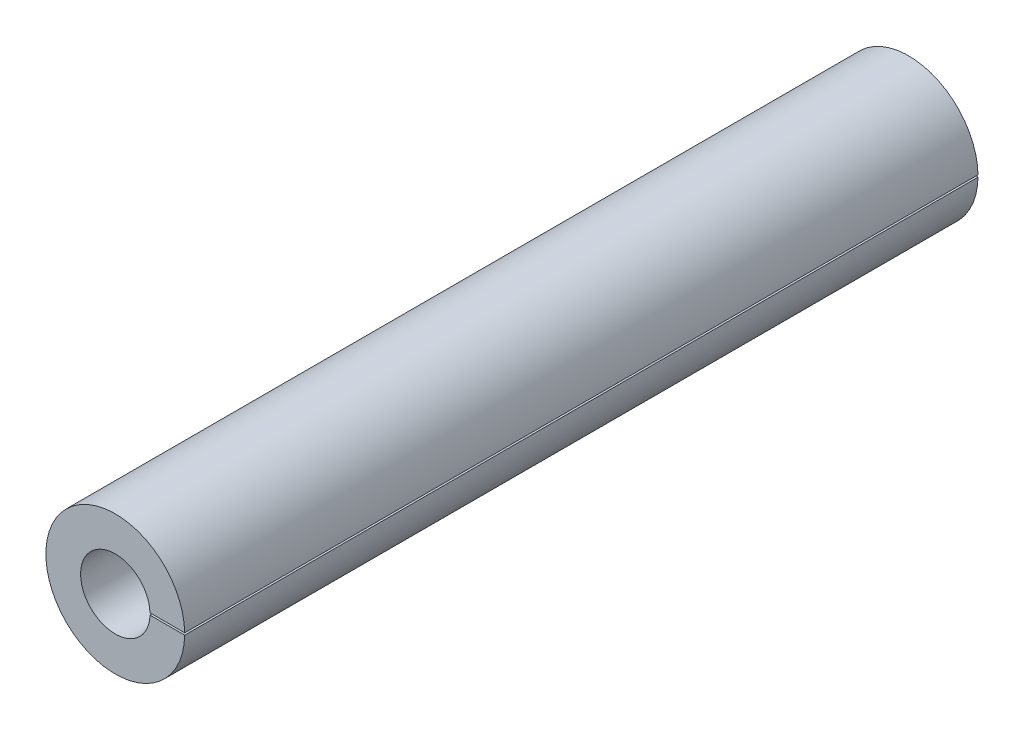
ISO-10303-21;
HEADER;
FILE_DESCRIPTION(('STEP AP214'),'2;1');
FILE_NAME('part.step','',(''),(''),'','','');
FILE_SCHEMA(('AUTOMOTIVE_DESIGN { 1 0 10303 214 1 1 1 1 }'));
ENDSEC;
DATA;
#1=APPLICATION_CONTEXT('core data for automotive mechanical design processes');
#2=APPLICATION_PROTOCOL_DEFINITION('international standard','automotive_design',2000,#1);
#3=PRODUCT_CONTEXT('',#1,'mechanical');
#4=PRODUCT('Part','Part','',(#3));
#5=PRODUCT_RELATED_PRODUCT_CATEGORY('part','',(#4));
#6=PRODUCT_DEFINITION_FORMATION('','',#4);
#7=PRODUCT_DEFINITION_CONTEXT('part definition',#1,'design');
#8=PRODUCT_DEFINITION('design','',#6,#7);
#9=PRODUCT_DEFINITION_SHAPE('','',#8);
#10=(LENGTH_UNIT() NAMED_UNIT(*) SI_UNIT(.MILLI.,.METRE.));
#11=(NAMED_UNIT(*) PLANE_ANGLE_UNIT() SI_UNIT($,.RADIAN.));
#12=(NAMED_UNIT(*) SI_UNIT($,.STERADIAN.) SOLID_ANGLE_UNIT());
#13=UNCERTAINTY_MEASURE_WITH_UNIT(LENGTH_MEASURE(1.E-05),#10,'distance_accuracy_value','');
#14=(GEOMETRIC_REPRESENTATION_CONTEXT(3) GLOBAL_UNCERTAINTY_ASSIGNED_CONTEXT((#13)) GLOBAL_UNIT_ASSIGNED_CONTEXT((#10,
#11,#12)) REPRESENTATION_CONTEXT('',''));
#15=CARTESIAN_POINT('',(0.,0.,0.));
#16=DIRECTION('',(0.,0.,1.));
#17=DIRECTION('',(1.,0.,0.));
#18=AXIS2_PLACEMENT_3D('',#15,#16,#17);
#19=CARTESIAN_POINT('',(0.,0.,800.));
#20=DIRECTION('',(0.,0.,-1.));
#21=DIRECTION('',(-1.,0.,0.));
#22=AXIS2_PLACEMENT_3D('',#19,#20,#21);
#23=CYLINDRICAL_SURFACE('',#22,70.);
#24=CARTESIAN_POINT('',(0.,0.,800.));
#25=DIRECTION('',(0.,0.,1.));
#26=DIRECTION('',(1.,0.,0.));
#27=AXIS2_PLACEMENT_3D('',#24,#25,#26);
#28=CIRCLE('',#27,70.);
#29=CARTESIAN_POINT('',(69.9928567783885,0.999999999999999,800.));
#30=VERTEX_POINT('',#29);
#31=CARTESIAN_POINT('',(69.9928567783885,-0.999999999999999,800.));
#32=VERTEX_POINT('',#31);
#33=EDGE_CURVE('E75',#30,#32,#28,.T.);
#34=ORIENTED_EDGE('',*,*,#33,.F.);
#35=DIRECTION('',(0.,0.,-1.));
#36=VECTOR('',#35,1.);
#37=CARTESIAN_POINT('',(69.9928567783885,0.999999999999999,800.));
#38=LINE('',#37,#36);
#39=CARTESIAN_POINT('',(69.9928567783885,0.999999999999999,0.));
#40=VERTEX_POINT('',#39);
#41=EDGE_CURVE('E85',#30,#40,#38,.T.);
#42=ORIENTED_EDGE('',*,*,#41,.T.);
#43=CARTESIAN_POINT('',(0.,0.,0.));
#44=DIRECTION('',(0.,0.,1.));
#45=DIRECTION('',(1.,0.,0.));
#46=AXIS2_PLACEMENT_3D('',#43,#44,#45);
#47=CIRCLE('',#46,70.);
#48=CARTESIAN_POINT('',(69.9928567783885,-0.999999999999999,0.));
#49=VERTEX_POINT('',#48);
#50=EDGE_CURVE('E87',#40,#49,#47,.T.);
#51=ORIENTED_EDGE('',*,*,#50,.T.);
#52=DIRECTION('',(0.,0.,-1.));
#53=VECTOR('',#52,1.);
#54=CARTESIAN_POINT('',(69.9928567783885,-0.999999999999999,800.));
#55=LINE('',#54,#53);
#56=EDGE_CURVE('E90',#49,#32,#55,.F.);
#57=ORIENTED_EDGE('',*,*,#56,.T.);
#58=EDGE_LOOP('',(#34,#42,#51,#57));
#59=FACE_BOUND('',#58,.T.);
#60=ADVANCED_FACE('F31',(#59),#23,.T.);
#61=CARTESIAN_POINT('',(0.,0.,800.));
#62=DIRECTION('',(0.,0.,1.));
#63=DIRECTION('',(1.,0.,0.));
#64=AXIS2_PLACEMENT_3D('',#61,#62,#63);
#65=PLANE('',#64);
#66=DIRECTION('',(-1.,0.,0.));
#67=VECTOR('',#66,1.);
#68=CARTESIAN_POINT('',(10.,0.999999999999999,800.));
#69=LINE('',#68,#67);
#70=CARTESIAN_POINT('',(34.9857113690718,0.999999999999999,800.));
#71=VERTEX_POINT('',#70);
#72=EDGE_CURVE('E45',#30,#71,#69,.T.);
#73=ORIENTED_EDGE('',*,*,#72,.F.);
#74=ORIENTED_EDGE('',*,*,#33,.T.);
#75=DIRECTION('',(1.,0.,0.));
#76=VECTOR('',#75,1.);
#77=CARTESIAN_POINT('',(10.,-0.999999999999999,800.));
#78=LINE('',#77,#76);
#79=CARTESIAN_POINT('',(34.9857113690718,-0.999999999999999,800.));
#80=VERTEX_POINT('',#79);
#81=EDGE_CURVE('E69',#80,#32,#78,.T.);
#82=ORIENTED_EDGE('',*,*,#81,.F.);
#83=CARTESIAN_POINT('',(0.,0.,800.));
#84=DIRECTION('',(0.,0.,1.));
#85=DIRECTION('',(1.,0.,0.));
#86=AXIS2_PLACEMENT_3D('',#83,#84,#85);
#87=CIRCLE('',#86,35.);
#88=EDGE_CURVE('E80',#71,#80,#87,.T.);
#89=ORIENTED_EDGE('',*,*,#88,.F.);
#90=EDGE_LOOP('',(#73,#74,#82,#89));
#91=FACE_BOUND('',#90,.T.);
#92=ADVANCED_FACE('F79',(#91),#65,.T.);
#93=CARTESIAN_POINT('',(0.,0.,0.));
#94=DIRECTION('',(0.,0.,1.));
#95=DIRECTION('',(1.,0.,0.));
#96=AXIS2_PLACEMENT_3D('',#93,#94,#95);
#97=PLANE('',#96);
#98=ORIENTED_EDGE('',*,*,#50,.F.);
#99=DIRECTION('',(-1.,0.,0.));
#100=VECTOR('',#99,1.);
#101=CARTESIAN_POINT('',(10.,0.999999999999999,0.));
#102=LINE('',#101,#100);
#103=CARTESIAN_POINT('',(34.9857113690718,0.999999999999999,0.));
#104=VERTEX_POINT('',#103);
#105=EDGE_CURVE('E101',#40,#104,#102,.T.);
#106=ORIENTED_EDGE('',*,*,#105,.T.);
#107=CARTESIAN_POINT('',(0.,0.,0.));
#108=DIRECTION('',(0.,0.,1.));
#109=DIRECTION('',(1.,0.,0.));
#110=AXIS2_PLACEMENT_3D('',#107,#108,#109);
#111=CIRCLE('',#110,35.);
#112=CARTESIAN_POINT('',(34.9857113690718,-0.999999999999999,0.));
#113=VERTEX_POINT('',#112);
#114=EDGE_CURVE('E84',#104,#113,#111,.T.);
#115=ORIENTED_EDGE('',*,*,#114,.T.);
#116=DIRECTION('',(1.,0.,0.));
#117=VECTOR('',#116,1.);
#118=CARTESIAN_POINT('',(10.,-0.999999999999999,0.));
#119=LINE('',#118,#117);
#120=EDGE_CURVE('E52',#113,#49,#119,.T.);
#121=ORIENTED_EDGE('',*,*,#120,.T.);
#122=EDGE_LOOP('',(#98,#106,#115,#121));
#123=FACE_BOUND('',#122,.T.);
#124=ADVANCED_FACE('F100',(#123),#97,.F.);
#125=CARTESIAN_POINT('',(0.,0.,0.));
#126=DIRECTION('',(0.,0.,1.));
#127=DIRECTION('',(1.,0.,0.));
#128=AXIS2_PLACEMENT_3D('',#125,#126,#127);
#129=CYLINDRICAL_SURFACE('',#128,35.);
#130=ORIENTED_EDGE('',*,*,#114,.F.);
#131=DIRECTION('',(0.,0.,1.));
#132=VECTOR('',#131,1.);
#133=CARTESIAN_POINT('',(34.9857113690718,0.999999999999999,0.));
#134=LINE('',#133,#132);
#135=EDGE_CURVE('E11',#104,#71,#134,.T.);
#136=ORIENTED_EDGE('',*,*,#135,.T.);
#137=ORIENTED_EDGE('',*,*,#88,.T.);
#138=DIRECTION('',(0.,0.,1.));
#139=VECTOR('',#138,1.);
#140=CARTESIAN_POINT('',(34.9857113690718,-0.999999999999999,0.));
#141=LINE('',#140,#139);
#142=EDGE_CURVE('E38',#80,#113,#141,.F.);
#143=ORIENTED_EDGE('',*,*,#142,.T.);
#144=EDGE_LOOP('',(#130,#136,#137,#143));
#145=FACE_BOUND('',#144,.T.);
#146=ADVANCED_FACE('F83',(#145),#129,.F.);
#147=CARTESIAN_POINT('',(10.,-0.999999999999999,0.));
#148=DIRECTION('',(0.,-1.,0.));
#149=DIRECTION('',(0.,0.,-1.));
#150=AXIS2_PLACEMENT_3D('',#147,#148,#149);
#151=PLANE('',#150);
#152=ORIENTED_EDGE('',*,*,#120,.F.);
#153=ORIENTED_EDGE('',*,*,#142,.F.);
#154=ORIENTED_EDGE('',*,*,#81,.T.);
#155=ORIENTED_EDGE('',*,*,#56,.F.);
#156=EDGE_LOOP('',(#152,#153,#154,#155));
#157=FACE_BOUND('',#156,.T.);
#158=ADVANCED_FACE('F68',(#157),#151,.F.);
#159=CARTESIAN_POINT('',(10.,0.999999999999999,0.));
#160=DIRECTION('',(0.,1.,0.));
#161=DIRECTION('',(0.,0.,1.));
#162=AXIS2_PLACEMENT_3D('',#159,#160,#161);
#163=PLANE('',#162);
#164=ORIENTED_EDGE('',*,*,#72,.T.);
#165=ORIENTED_EDGE('',*,*,#135,.F.);
#166=ORIENTED_EDGE('',*,*,#105,.F.);
#167=ORIENTED_EDGE('',*,*,#41,.F.);
#168=EDGE_LOOP('',(#164,#165,#166,#167));
#169=FACE_BOUND('',#168,.T.);
#170=ADVANCED_FACE('F105',(#169),#163,.F.);
#171=CLOSED_SHELL('',(#60,#92,#124,#146,#158,#170));
#172=MANIFOLD_SOLID_BREP('B2',#171);
#173=ADVANCED_BREP_SHAPE_REPRESENTATION('',(#18,#172),#14);
#174=SHAPE_DEFINITION_REPRESENTATION(#9,#173);
ENDSEC;
END-ISO-10303-21;
